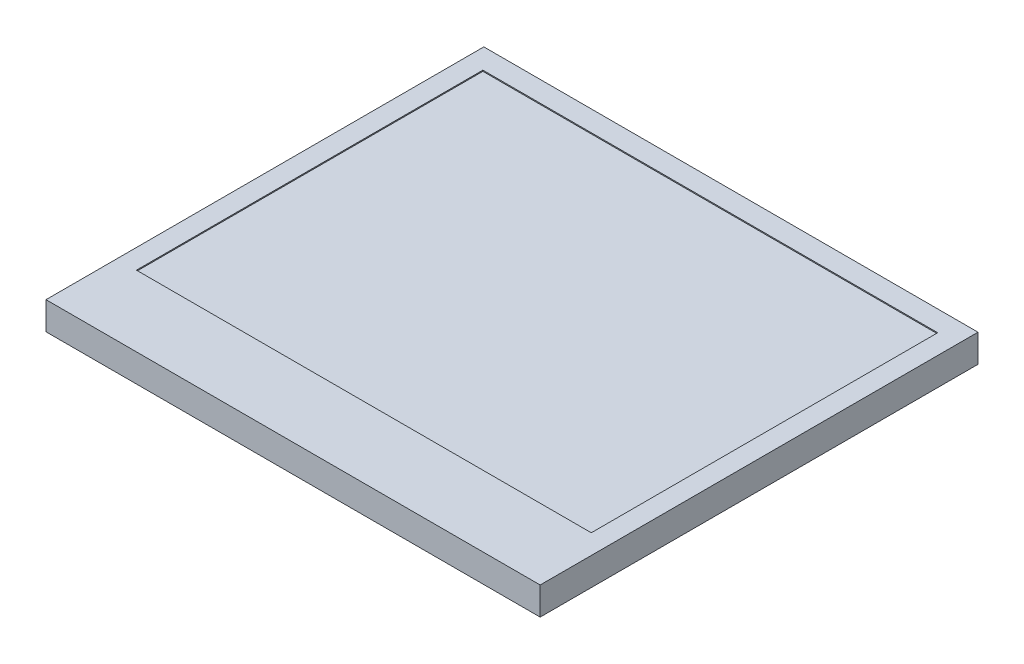
ISO-10303-21;
HEADER;
FILE_DESCRIPTION(('STEP AP214'),'2;1');
FILE_NAME('part.step','',(''),(''),'','','');
FILE_SCHEMA(('AUTOMOTIVE_DESIGN { 1 0 10303 214 1 1 1 1 }'));
ENDSEC;
DATA;
#1=APPLICATION_CONTEXT('core data for automotive mechanical design processes');
#2=APPLICATION_PROTOCOL_DEFINITION('international standard','automotive_design',2000,#1);
#3=PRODUCT_CONTEXT('',#1,'mechanical');
#4=PRODUCT('Part','Part','',(#3));
#5=PRODUCT_RELATED_PRODUCT_CATEGORY('part','',(#4));
#6=PRODUCT_DEFINITION_FORMATION('','',#4);
#7=PRODUCT_DEFINITION_CONTEXT('part definition',#1,'design');
#8=PRODUCT_DEFINITION('design','',#6,#7);
#9=PRODUCT_DEFINITION_SHAPE('','',#8);
#10=(LENGTH_UNIT() NAMED_UNIT(*) SI_UNIT(.MILLI.,.METRE.));
#11=(NAMED_UNIT(*) PLANE_ANGLE_UNIT() SI_UNIT($,.RADIAN.));
#12=(NAMED_UNIT(*) SI_UNIT($,.STERADIAN.) SOLID_ANGLE_UNIT());
#13=UNCERTAINTY_MEASURE_WITH_UNIT(LENGTH_MEASURE(1.E-05),#10,'distance_accuracy_value','');
#14=(GEOMETRIC_REPRESENTATION_CONTEXT(3) GLOBAL_UNCERTAINTY_ASSIGNED_CONTEXT((#13)) GLOBAL_UNIT_ASSIGNED_CONTEXT((#10,
#11,#12)) REPRESENTATION_CONTEXT('',''));
#15=CARTESIAN_POINT('',(0.,0.,0.));
#16=DIRECTION('',(0.,0.,1.));
#17=DIRECTION('',(1.,0.,0.));
#18=AXIS2_PLACEMENT_3D('',#15,#16,#17);
#19=CARTESIAN_POINT('',(23.25,2.62,20.6));
#20=DIRECTION('',(-1.,0.,0.));
#21=DIRECTION('',(0.,0.,1.));
#22=AXIS2_PLACEMENT_3D('',#19,#20,#21);
#23=PLANE('',#22);
#24=DIRECTION('',(0.,0.,-1.));
#25=VECTOR('',#24,1.);
#26=CARTESIAN_POINT('',(23.25,0.,20.6));
#27=LINE('',#26,#25);
#28=CARTESIAN_POINT('',(23.25,0.,20.6));
#29=VERTEX_POINT('',#28);
#30=CARTESIAN_POINT('',(23.25,0.,-20.6));
#31=VERTEX_POINT('',#30);
#32=EDGE_CURVE('E143',#29,#31,#27,.T.);
#33=ORIENTED_EDGE('',*,*,#32,.T.);
#34=DIRECTION('',(0.,-1.,0.));
#35=VECTOR('',#34,1.);
#36=CARTESIAN_POINT('',(23.25,2.62,-20.6));
#37=LINE('',#36,#35);
#38=CARTESIAN_POINT('',(23.25,2.62,-20.6));
#39=VERTEX_POINT('',#38);
#40=EDGE_CURVE('E11',#39,#31,#37,.T.);
#41=ORIENTED_EDGE('',*,*,#40,.F.);
#42=DIRECTION('',(0.,0.,-1.));
#43=VECTOR('',#42,1.);
#44=CARTESIAN_POINT('',(23.25,2.62,20.6));
#45=LINE('',#44,#43);
#46=CARTESIAN_POINT('',(23.25,2.62,20.6));
#47=VERTEX_POINT('',#46);
#48=EDGE_CURVE('E147',#47,#39,#45,.T.);
#49=ORIENTED_EDGE('',*,*,#48,.F.);
#50=DIRECTION('',(0.,-1.,0.));
#51=VECTOR('',#50,1.);
#52=CARTESIAN_POINT('',(23.25,2.62,20.6));
#53=LINE('',#52,#51);
#54=EDGE_CURVE('E153',#47,#29,#53,.T.);
#55=ORIENTED_EDGE('',*,*,#54,.T.);
#56=EDGE_LOOP('',(#33,#41,#49,#55));
#57=FACE_BOUND('',#56,.T.);
#58=ADVANCED_FACE('F35',(#57),#23,.F.);
#59=CARTESIAN_POINT('',(-23.25,2.62,-20.6));
#60=DIRECTION('',(0.,0.,1.));
#61=DIRECTION('',(1.,0.,0.));
#62=AXIS2_PLACEMENT_3D('',#59,#60,#61);
#63=PLANE('',#62);
#64=DIRECTION('',(-1.,0.,0.));
#65=VECTOR('',#64,1.);
#66=CARTESIAN_POINT('',(-23.25,0.,-20.6));
#67=LINE('',#66,#65);
#68=CARTESIAN_POINT('',(-23.25,0.,-20.6));
#69=VERTEX_POINT('',#68);
#70=EDGE_CURVE('E156',#31,#69,#67,.T.);
#71=ORIENTED_EDGE('',*,*,#70,.T.);
#72=DIRECTION('',(0.,-1.,0.));
#73=VECTOR('',#72,1.);
#74=CARTESIAN_POINT('',(-23.25,2.62,-20.6));
#75=LINE('',#74,#73);
#76=CARTESIAN_POINT('',(-23.25,2.62,-20.6));
#77=VERTEX_POINT('',#76);
#78=EDGE_CURVE('E42',#77,#69,#75,.T.);
#79=ORIENTED_EDGE('',*,*,#78,.F.);
#80=DIRECTION('',(-1.,0.,0.));
#81=VECTOR('',#80,1.);
#82=CARTESIAN_POINT('',(-23.25,2.62,-20.6));
#83=LINE('',#82,#81);
#84=EDGE_CURVE('E86',#39,#77,#83,.T.);
#85=ORIENTED_EDGE('',*,*,#84,.F.);
#86=ORIENTED_EDGE('',*,*,#40,.T.);
#87=EDGE_LOOP('',(#71,#79,#85,#86));
#88=FACE_BOUND('',#87,.T.);
#89=ADVANCED_FACE('F185',(#88),#63,.F.);
#90=CARTESIAN_POINT('',(-23.25,2.62,20.6));
#91=DIRECTION('',(1.,0.,0.));
#92=DIRECTION('',(0.,0.,-1.));
#93=AXIS2_PLACEMENT_3D('',#90,#91,#92);
#94=PLANE('',#93);
#95=DIRECTION('',(0.,0.,1.));
#96=VECTOR('',#95,1.);
#97=CARTESIAN_POINT('',(-23.25,0.,20.6));
#98=LINE('',#97,#96);
#99=CARTESIAN_POINT('',(-23.25,0.,20.6));
#100=VERTEX_POINT('',#99);
#101=EDGE_CURVE('E158',#69,#100,#98,.T.);
#102=ORIENTED_EDGE('',*,*,#101,.T.);
#103=DIRECTION('',(0.,-1.,0.));
#104=VECTOR('',#103,1.);
#105=CARTESIAN_POINT('',(-23.25,2.62,20.6));
#106=LINE('',#105,#104);
#107=CARTESIAN_POINT('',(-23.25,2.62,20.6));
#108=VERTEX_POINT('',#107);
#109=EDGE_CURVE('E162',#108,#100,#106,.T.);
#110=ORIENTED_EDGE('',*,*,#109,.F.);
#111=DIRECTION('',(0.,0.,1.));
#112=VECTOR('',#111,1.);
#113=CARTESIAN_POINT('',(-23.25,2.62,20.6));
#114=LINE('',#113,#112);
#115=EDGE_CURVE('E150',#77,#108,#114,.T.);
#116=ORIENTED_EDGE('',*,*,#115,.F.);
#117=ORIENTED_EDGE('',*,*,#78,.T.);
#118=EDGE_LOOP('',(#102,#110,#116,#117));
#119=FACE_BOUND('',#118,.T.);
#120=ADVANCED_FACE('F167',(#119),#94,.F.);
#121=CARTESIAN_POINT('',(-23.25,2.62,20.6));
#122=DIRECTION('',(0.,0.,-1.));
#123=DIRECTION('',(-1.,0.,0.));
#124=AXIS2_PLACEMENT_3D('',#121,#122,#123);
#125=PLANE('',#124);
#126=DIRECTION('',(1.,0.,0.));
#127=VECTOR('',#126,1.);
#128=CARTESIAN_POINT('',(-23.25,0.,20.6));
#129=LINE('',#128,#127);
#130=EDGE_CURVE('E79',#100,#29,#129,.T.);
#131=ORIENTED_EDGE('',*,*,#130,.T.);
#132=ORIENTED_EDGE('',*,*,#54,.F.);
#133=DIRECTION('',(1.,0.,0.));
#134=VECTOR('',#133,1.);
#135=CARTESIAN_POINT('',(-23.25,2.62,20.6));
#136=LINE('',#135,#134);
#137=EDGE_CURVE('E58',#108,#47,#136,.T.);
#138=ORIENTED_EDGE('',*,*,#137,.F.);
#139=ORIENTED_EDGE('',*,*,#109,.T.);
#140=EDGE_LOOP('',(#131,#132,#138,#139));
#141=FACE_BOUND('',#140,.T.);
#142=ADVANCED_FACE('F175',(#141),#125,.F.);
#143=CARTESIAN_POINT('',(0.,2.62,0.));
#144=DIRECTION('',(0.,-1.,0.));
#145=DIRECTION('',(0.,0.,-1.));
#146=AXIS2_PLACEMENT_3D('',#143,#144,#145);
#147=PLANE('',#146);
#148=DIRECTION('',(1.,0.,0.));
#149=VECTOR('',#148,1.);
#150=CARTESIAN_POINT('',(-21.4,2.62,13.94));
#151=LINE('',#150,#149);
#152=CARTESIAN_POINT('',(-21.4,2.62,13.94));
#153=VERTEX_POINT('',#152);
#154=CARTESIAN_POINT('',(21.4,2.62,13.94));
#155=VERTEX_POINT('',#154);
#156=EDGE_CURVE('E137',#153,#155,#151,.T.);
#157=ORIENTED_EDGE('',*,*,#156,.F.);
#158=DIRECTION('',(0.,0.,1.));
#159=VECTOR('',#158,1.);
#160=CARTESIAN_POINT('',(-21.4,2.62,-18.66));
#161=LINE('',#160,#159);
#162=CARTESIAN_POINT('',(-21.4,2.62,-18.66));
#163=VERTEX_POINT('',#162);
#164=EDGE_CURVE('E49',#163,#153,#161,.T.);
#165=ORIENTED_EDGE('',*,*,#164,.F.);
#166=DIRECTION('',(-1.,0.,0.));
#167=VECTOR('',#166,1.);
#168=CARTESIAN_POINT('',(-21.4,2.62,-18.66));
#169=LINE('',#168,#167);
#170=CARTESIAN_POINT('',(21.4,2.62,-18.66));
#171=VERTEX_POINT('',#170);
#172=EDGE_CURVE('E128',#171,#163,#169,.T.);
#173=ORIENTED_EDGE('',*,*,#172,.F.);
#174=DIRECTION('',(0.,0.,-1.));
#175=VECTOR('',#174,1.);
#176=CARTESIAN_POINT('',(21.4,2.62,-18.66));
#177=LINE('',#176,#175);
#178=EDGE_CURVE('E131',#155,#171,#177,.T.);
#179=ORIENTED_EDGE('',*,*,#178,.F.);
#180=EDGE_LOOP('',(#157,#165,#173,#179));
#181=FACE_BOUND('',#180,.T.);
#182=ORIENTED_EDGE('',*,*,#48,.T.);
#183=ORIENTED_EDGE('',*,*,#84,.T.);
#184=ORIENTED_EDGE('',*,*,#115,.T.);
#185=ORIENTED_EDGE('',*,*,#137,.T.);
#186=EDGE_LOOP('',(#182,#183,#184,#185));
#187=FACE_BOUND('',#186,.T.);
#188=ADVANCED_FACE('F177',(#181,#187),#147,.F.);
#189=CARTESIAN_POINT('',(0.,0.,0.));
#190=DIRECTION('',(0.,-1.,0.));
#191=DIRECTION('',(0.,0.,-1.));
#192=AXIS2_PLACEMENT_3D('',#189,#190,#191);
#193=PLANE('',#192);
#194=ORIENTED_EDGE('',*,*,#32,.F.);
#195=ORIENTED_EDGE('',*,*,#130,.F.);
#196=ORIENTED_EDGE('',*,*,#101,.F.);
#197=ORIENTED_EDGE('',*,*,#70,.F.);
#198=EDGE_LOOP('',(#194,#195,#196,#197));
#199=FACE_BOUND('',#198,.T.);
#200=ADVANCED_FACE('F171',(#199),#193,.T.);
#201=CARTESIAN_POINT('',(-21.4,2.52,-18.66));
#202=DIRECTION('',(-1.,0.,0.));
#203=DIRECTION('',(0.,0.,1.));
#204=AXIS2_PLACEMENT_3D('',#201,#202,#203);
#205=PLANE('',#204);
#206=ORIENTED_EDGE('',*,*,#164,.T.);
#207=DIRECTION('',(0.,1.,0.));
#208=VECTOR('',#207,1.);
#209=CARTESIAN_POINT('',(-21.4,2.52,13.94));
#210=LINE('',#209,#208);
#211=CARTESIAN_POINT('',(-21.4,2.52,13.94));
#212=VERTEX_POINT('',#211);
#213=EDGE_CURVE('E106',#212,#153,#210,.T.);
#214=ORIENTED_EDGE('',*,*,#213,.F.);
#215=DIRECTION('',(0.,0.,1.));
#216=VECTOR('',#215,1.);
#217=CARTESIAN_POINT('',(-21.4,2.52,-18.66));
#218=LINE('',#217,#216);
#219=CARTESIAN_POINT('',(-21.4,2.52,-18.66));
#220=VERTEX_POINT('',#219);
#221=EDGE_CURVE('E110',#220,#212,#218,.T.);
#222=ORIENTED_EDGE('',*,*,#221,.F.);
#223=DIRECTION('',(0.,1.,0.));
#224=VECTOR('',#223,1.);
#225=CARTESIAN_POINT('',(-21.4,2.52,-18.66));
#226=LINE('',#225,#224);
#227=EDGE_CURVE('E141',#220,#163,#226,.T.);
#228=ORIENTED_EDGE('',*,*,#227,.T.);
#229=EDGE_LOOP('',(#206,#214,#222,#228));
#230=FACE_BOUND('',#229,.T.);
#231=ADVANCED_FACE('F108',(#230),#205,.F.);
#232=CARTESIAN_POINT('',(-21.4,2.52,-18.66));
#233=DIRECTION('',(0.,0.,-1.));
#234=DIRECTION('',(-1.,0.,0.));
#235=AXIS2_PLACEMENT_3D('',#232,#233,#234);
#236=PLANE('',#235);
#237=ORIENTED_EDGE('',*,*,#172,.T.);
#238=ORIENTED_EDGE('',*,*,#227,.F.);
#239=DIRECTION('',(-1.,0.,0.));
#240=VECTOR('',#239,1.);
#241=CARTESIAN_POINT('',(-21.4,2.52,-18.66));
#242=LINE('',#241,#240);
#243=CARTESIAN_POINT('',(21.4,2.52,-18.66));
#244=VERTEX_POINT('',#243);
#245=EDGE_CURVE('E116',#244,#220,#242,.T.);
#246=ORIENTED_EDGE('',*,*,#245,.F.);
#247=DIRECTION('',(0.,1.,0.));
#248=VECTOR('',#247,1.);
#249=CARTESIAN_POINT('',(21.4,2.52,-18.66));
#250=LINE('',#249,#248);
#251=EDGE_CURVE('E144',#244,#171,#250,.T.);
#252=ORIENTED_EDGE('',*,*,#251,.T.);
#253=EDGE_LOOP('',(#237,#238,#246,#252));
#254=FACE_BOUND('',#253,.T.);
#255=ADVANCED_FACE('F224',(#254),#236,.F.);
#256=CARTESIAN_POINT('',(21.4,2.52,-18.66));
#257=DIRECTION('',(1.,0.,0.));
#258=DIRECTION('',(0.,0.,-1.));
#259=AXIS2_PLACEMENT_3D('',#256,#257,#258);
#260=PLANE('',#259);
#261=ORIENTED_EDGE('',*,*,#178,.T.);
#262=ORIENTED_EDGE('',*,*,#251,.F.);
#263=DIRECTION('',(0.,0.,-1.));
#264=VECTOR('',#263,1.);
#265=CARTESIAN_POINT('',(21.4,2.52,-18.66));
#266=LINE('',#265,#264);
#267=CARTESIAN_POINT('',(21.4,2.52,13.94));
#268=VERTEX_POINT('',#267);
#269=EDGE_CURVE('E124',#268,#244,#266,.T.);
#270=ORIENTED_EDGE('',*,*,#269,.F.);
#271=DIRECTION('',(0.,1.,0.));
#272=VECTOR('',#271,1.);
#273=CARTESIAN_POINT('',(21.4,2.52,13.94));
#274=LINE('',#273,#272);
#275=EDGE_CURVE('E115',#268,#155,#274,.T.);
#276=ORIENTED_EDGE('',*,*,#275,.T.);
#277=EDGE_LOOP('',(#261,#262,#270,#276));
#278=FACE_BOUND('',#277,.T.);
#279=ADVANCED_FACE('F233',(#278),#260,.F.);
#280=CARTESIAN_POINT('',(-21.4,2.52,13.94));
#281=DIRECTION('',(0.,0.,1.));
#282=DIRECTION('',(1.,0.,0.));
#283=AXIS2_PLACEMENT_3D('',#280,#281,#282);
#284=PLANE('',#283);
#285=ORIENTED_EDGE('',*,*,#156,.T.);
#286=ORIENTED_EDGE('',*,*,#275,.F.);
#287=DIRECTION('',(1.,0.,0.));
#288=VECTOR('',#287,1.);
#289=CARTESIAN_POINT('',(-21.4,2.52,13.94));
#290=LINE('',#289,#288);
#291=EDGE_CURVE('E119',#212,#268,#290,.T.);
#292=ORIENTED_EDGE('',*,*,#291,.F.);
#293=ORIENTED_EDGE('',*,*,#213,.T.);
#294=EDGE_LOOP('',(#285,#286,#292,#293));
#295=FACE_BOUND('',#294,.T.);
#296=ADVANCED_FACE('F120',(#295),#284,.F.);
#297=CARTESIAN_POINT('',(0.,2.52,0.));
#298=DIRECTION('',(0.,1.,0.));
#299=DIRECTION('',(0.,0.,1.));
#300=AXIS2_PLACEMENT_3D('',#297,#298,#299);
#301=PLANE('',#300);
#302=ORIENTED_EDGE('',*,*,#221,.T.);
#303=ORIENTED_EDGE('',*,*,#291,.T.);
#304=ORIENTED_EDGE('',*,*,#269,.T.);
#305=ORIENTED_EDGE('',*,*,#245,.T.);
#306=EDGE_LOOP('',(#302,#303,#304,#305));
#307=FACE_BOUND('',#306,.T.);
#308=ADVANCED_FACE('F126',(#307),#301,.T.);
#309=CLOSED_SHELL('',(#58,#89,#120,#142,#188,#200,#231,#255,#279,#296,#308));
#310=MANIFOLD_SOLID_BREP('B2',#309);
#311=ADVANCED_BREP_SHAPE_REPRESENTATION('',(#18,#310),#14);
#312=SHAPE_DEFINITION_REPRESENTATION(#9,#311);
ENDSEC;
END-ISO-10303-21;
